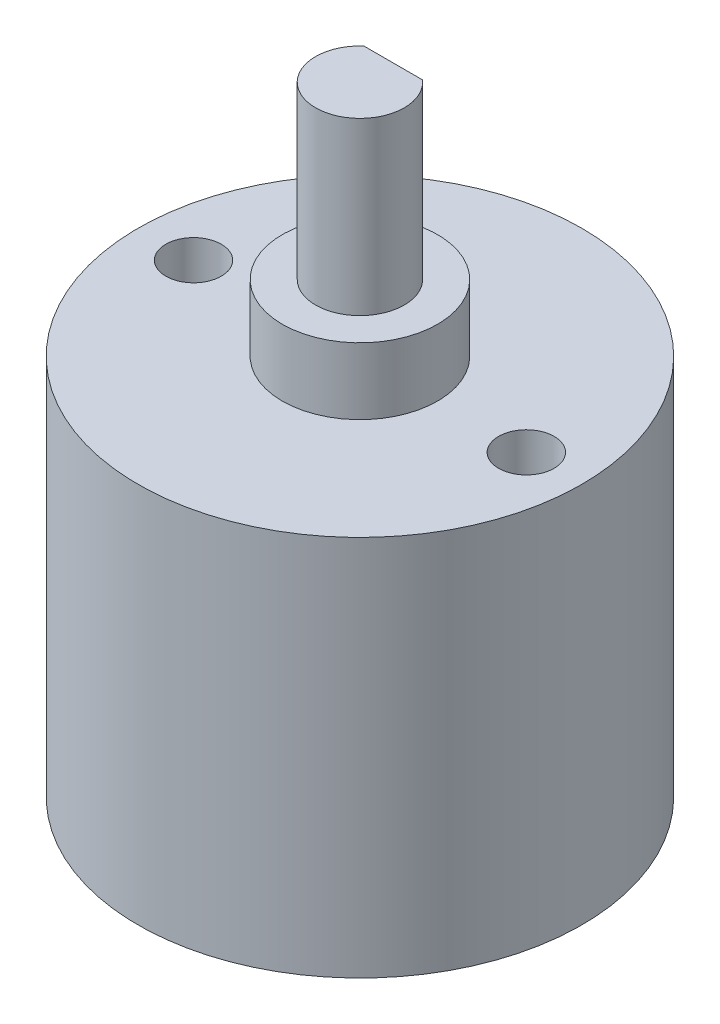
ISO-10303-21;
HEADER;
FILE_DESCRIPTION(('STEP AP214'),'2;1');
FILE_NAME('part.step','',(''),(''),'','','');
FILE_SCHEMA(('AUTOMOTIVE_DESIGN { 1 0 10303 214 1 1 1 1 }'));
ENDSEC;
DATA;
#1=APPLICATION_CONTEXT('core data for automotive mechanical design processes');
#2=APPLICATION_PROTOCOL_DEFINITION('international standard','automotive_design',2000,#1);
#3=PRODUCT_CONTEXT('',#1,'mechanical');
#4=PRODUCT('Part','Part','',(#3));
#5=PRODUCT_RELATED_PRODUCT_CATEGORY('part','',(#4));
#6=PRODUCT_DEFINITION_FORMATION('','',#4);
#7=PRODUCT_DEFINITION_CONTEXT('part definition',#1,'design');
#8=PRODUCT_DEFINITION('design','',#6,#7);
#9=PRODUCT_DEFINITION_SHAPE('','',#8);
#10=(LENGTH_UNIT() NAMED_UNIT(*) SI_UNIT(.MILLI.,.METRE.));
#11=(NAMED_UNIT(*) PLANE_ANGLE_UNIT() SI_UNIT($,.RADIAN.));
#12=(NAMED_UNIT(*) SI_UNIT($,.STERADIAN.) SOLID_ANGLE_UNIT());
#13=UNCERTAINTY_MEASURE_WITH_UNIT(LENGTH_MEASURE(1.E-05),#10,'distance_accuracy_value','');
#14=(GEOMETRIC_REPRESENTATION_CONTEXT(3) GLOBAL_UNCERTAINTY_ASSIGNED_CONTEXT((#13)) GLOBAL_UNIT_ASSIGNED_CONTEXT((#10,
#11,#12)) REPRESENTATION_CONTEXT('',''));
#15=CARTESIAN_POINT('',(0.,0.,0.));
#16=DIRECTION('',(0.,0.,1.));
#17=DIRECTION('',(1.,0.,0.));
#18=AXIS2_PLACEMENT_3D('',#15,#16,#17);
#19=CARTESIAN_POINT('',(0.,20.2,0.));
#20=DIRECTION('',(0.,1.,0.));
#21=DIRECTION('',(0.,0.,1.));
#22=AXIS2_PLACEMENT_3D('',#19,#20,#21);
#23=PLANE('',#22);
#24=CARTESIAN_POINT('',(0.,20.2,0.));
#25=DIRECTION('',(0.,1.,0.));
#26=DIRECTION('',(0.,0.,1.));
#27=AXIS2_PLACEMENT_3D('',#24,#25,#26);
#28=CIRCLE('',#27,3.5);
#29=CARTESIAN_POINT('',(0.,20.2,3.5));
#30=VERTEX_POINT('',#29);
#31=EDGE_CURVE('E81',#30,#30,#28,.T.);
#32=ORIENTED_EDGE('',*,*,#31,.T.);
#33=EDGE_LOOP('',(#32));
#34=FACE_BOUND('',#33,.T.);
#35=DIRECTION('',(1.,0.,0.));
#36=VECTOR('',#35,1.);
#37=CARTESIAN_POINT('',(0.,20.2,-1.5));
#38=LINE('',#37,#36);
#39=CARTESIAN_POINT('',(-1.3228756555323,20.2,-1.5));
#40=VERTEX_POINT('',#39);
#41=CARTESIAN_POINT('',(1.3228756555323,20.2,-1.5));
#42=VERTEX_POINT('',#41);
#43=EDGE_CURVE('E49',#40,#42,#38,.T.);
#44=ORIENTED_EDGE('',*,*,#43,.T.);
#45=CARTESIAN_POINT('',(0.,20.2,0.));
#46=DIRECTION('',(0.,1.,0.));
#47=DIRECTION('',(0.,0.,1.));
#48=AXIS2_PLACEMENT_3D('',#45,#46,#47);
#49=CIRCLE('',#48,2.);
#50=EDGE_CURVE('E63',#40,#42,#49,.T.);
#51=ORIENTED_EDGE('',*,*,#50,.F.);
#52=EDGE_LOOP('',(#44,#51));
#53=FACE_BOUND('',#52,.T.);
#54=ADVANCED_FACE('F35',(#34,#53),#23,.T.);
#55=CARTESIAN_POINT('',(0.,17.2,0.));
#56=DIRECTION('',(0.,-1.,0.));
#57=DIRECTION('',(0.,0.,-1.));
#58=AXIS2_PLACEMENT_3D('',#55,#56,#57);
#59=CYLINDRICAL_SURFACE('',#58,10.);
#60=CARTESIAN_POINT('',(0.,17.2,0.));
#61=DIRECTION('',(0.,1.,0.));
#62=DIRECTION('',(0.,0.,1.));
#63=AXIS2_PLACEMENT_3D('',#60,#61,#62);
#64=CIRCLE('',#63,10.);
#65=CARTESIAN_POINT('',(0.,17.2,-10.));
#66=VERTEX_POINT('',#65);
#67=EDGE_CURVE('E11',#66,#66,#64,.T.);
#68=CARTESIAN_POINT('',(0.,0.,0.));
#69=DIRECTION('',(0.,1.,0.));
#70=DIRECTION('',(0.,0.,1.));
#71=AXIS2_PLACEMENT_3D('',#68,#69,#70);
#72=CIRCLE('',#71,10.);
#73=CARTESIAN_POINT('',(0.,0.,-10.));
#74=VERTEX_POINT('',#73);
#75=EDGE_CURVE('E39',#74,#74,#72,.T.);
#76=CARTESIAN_POINT('',(0.,17.2,-10.));
#77=CARTESIAN_POINT('',(0.,17.0208333333333,-10.));
#78=CARTESIAN_POINT('',(0.,16.8416666666667,-10.));
#79=CARTESIAN_POINT('',(0.,16.4833333333333,-10.));
#80=CARTESIAN_POINT('',(0.,16.3041666666667,-10.));
#81=CARTESIAN_POINT('',(0.,15.9458333333333,-10.));
#82=CARTESIAN_POINT('',(0.,15.7666666666667,-10.));
#83=CARTESIAN_POINT('',(0.,15.4083333333333,-10.));
#84=CARTESIAN_POINT('',(0.,15.2291666666667,-10.));
#85=CARTESIAN_POINT('',(0.,14.8708333333333,-10.));
#86=CARTESIAN_POINT('',(0.,14.6916666666667,-10.));
#87=CARTESIAN_POINT('',(0.,14.3333333333333,-10.));
#88=CARTESIAN_POINT('',(0.,14.1541666666667,-10.));
#89=CARTESIAN_POINT('',(0.,13.7958333333333,-10.));
#90=CARTESIAN_POINT('',(0.,13.6166666666667,-10.));
#91=CARTESIAN_POINT('',(0.,13.2583333333333,-10.));
#92=CARTESIAN_POINT('',(0.,13.0791666666667,-10.));
#93=CARTESIAN_POINT('',(0.,12.7208333333333,-10.));
#94=CARTESIAN_POINT('',(0.,12.5416666666667,-10.));
#95=CARTESIAN_POINT('',(0.,12.1833333333333,-10.));
#96=CARTESIAN_POINT('',(0.,12.0041666666667,-10.));
#97=CARTESIAN_POINT('',(0.,11.6458333333333,-10.));
#98=CARTESIAN_POINT('',(0.,11.4666666666667,-10.));
#99=CARTESIAN_POINT('',(0.,11.1083333333333,-10.));
#100=CARTESIAN_POINT('',(0.,10.9291666666667,-10.));
#101=CARTESIAN_POINT('',(0.,10.5708333333333,-10.));
#102=CARTESIAN_POINT('',(0.,10.3916666666667,-10.));
#103=CARTESIAN_POINT('',(0.,10.0333333333333,-10.));
#104=CARTESIAN_POINT('',(0.,9.85416666666666,-10.));
#105=CARTESIAN_POINT('',(0.,9.49583333333333,-10.));
#106=CARTESIAN_POINT('',(0.,9.31666666666666,-10.));
#107=CARTESIAN_POINT('',(0.,8.95833333333333,-10.));
#108=CARTESIAN_POINT('',(0.,8.77916666666667,-10.));
#109=CARTESIAN_POINT('',(0.,8.42083333333333,-10.));
#110=CARTESIAN_POINT('',(0.,8.24166666666667,-10.));
#111=CARTESIAN_POINT('',(0.,7.88333333333333,-10.));
#112=CARTESIAN_POINT('',(0.,7.70416666666667,-10.));
#113=CARTESIAN_POINT('',(0.,7.34583333333333,-10.));
#114=CARTESIAN_POINT('',(0.,7.16666666666666,-10.));
#115=CARTESIAN_POINT('',(0.,6.80833333333333,-10.));
#116=CARTESIAN_POINT('',(0.,6.62916666666666,-10.));
#117=CARTESIAN_POINT('',(0.,6.27083333333333,-10.));
#118=CARTESIAN_POINT('',(0.,6.09166666666666,-10.));
#119=CARTESIAN_POINT('',(0.,5.73333333333333,-10.));
#120=CARTESIAN_POINT('',(0.,5.55416666666666,-10.));
#121=CARTESIAN_POINT('',(0.,5.19583333333333,-10.));
#122=CARTESIAN_POINT('',(0.,5.01666666666666,-10.));
#123=CARTESIAN_POINT('',(0.,4.65833333333333,-10.));
#124=CARTESIAN_POINT('',(0.,4.47916666666667,-10.));
#125=CARTESIAN_POINT('',(0.,4.12083333333333,-10.));
#126=CARTESIAN_POINT('',(0.,3.94166666666666,-10.));
#127=CARTESIAN_POINT('',(0.,3.58333333333333,-10.));
#128=CARTESIAN_POINT('',(0.,3.40416666666666,-10.));
#129=CARTESIAN_POINT('',(0.,3.04583333333333,-10.));
#130=CARTESIAN_POINT('',(0.,2.86666666666666,-10.));
#131=CARTESIAN_POINT('',(0.,2.50833333333333,-10.));
#132=CARTESIAN_POINT('',(0.,2.32916666666666,-10.));
#133=CARTESIAN_POINT('',(0.,1.97083333333333,-10.));
#134=CARTESIAN_POINT('',(0.,1.79166666666666,-10.));
#135=CARTESIAN_POINT('',(0.,1.43333333333333,-10.));
#136=CARTESIAN_POINT('',(0.,1.25416666666666,-10.));
#137=CARTESIAN_POINT('',(0.,0.895833333333329,-10.));
#138=CARTESIAN_POINT('',(0.,0.716666666666663,-10.));
#139=CARTESIAN_POINT('',(0.,0.35833333333333,-10.));
#140=CARTESIAN_POINT('',(0.,0.179166666666663,-10.));
#141=CARTESIAN_POINT('',(0.,0.,-10.));
#142=B_SPLINE_CURVE_WITH_KNOTS('',3,(#76,#77,#78,#79,#80,#81,#82,#83,#84,#85,#86,#87,#88,#89,
#90,#91,#92,#93,#94,#95,#96,#97,#98,#99,#100,#101,#102,#103,#104,#105,#106,#107,#108,#109,#110,
#111,#112,#113,#114,#115,#116,#117,#118,#119,#120,#121,#122,#123,#124,#125,#126,#127,#128,#129,
#130,#131,#132,#133,#134,#135,#136,#137,#138,#139,#140,#141),.UNSPECIFIED.,.F.,.F.,(4,2,2,2,2,2,
2,2,2,2,2,2,2,2,2,2,2,2,2,2,2,2,2,2,2,2,2,2,2,2,2,2,4),(0.,0.5375,1.075,1.6125,2.15,2.6875,
3.225,3.7625,4.3,4.8375,5.375,5.9125,6.45,6.9875,7.525,8.0625,8.6,9.1375,9.675,10.2125,10.75,
11.2875,11.825,12.3625,12.9,13.4375,13.975,14.5125,15.05,15.5875,16.125,16.6625,17.2),.UNSPECIFIED.);
#143=EDGE_CURVE('BSEAM37',#66,#74,#142,.T.);
#144=ORIENTED_EDGE('',*,*,#67,.F.);
#145=ORIENTED_EDGE('',*,*,#75,.T.);
#146=ORIENTED_EDGE('',*,*,#143,.T.);
#147=ORIENTED_EDGE('',*,*,#143,.F.);
#148=EDGE_LOOP('',(#144,#146,#145,#147));
#149=FACE_BOUND('',#148,.T.);
#150=ADVANCED_FACE('F37',(#149),#59,.T.);
#151=CARTESIAN_POINT('',(0.,17.2,0.));
#152=DIRECTION('',(0.,1.,0.));
#153=DIRECTION('',(0.,0.,1.));
#154=AXIS2_PLACEMENT_3D('',#151,#152,#153);
#155=PLANE('',#154);
#156=CARTESIAN_POINT('',(7.5,17.2,0.));
#157=DIRECTION('',(0.,1.,0.));
#158=DIRECTION('',(0.,0.,1.));
#159=AXIS2_PLACEMENT_3D('',#156,#157,#158);
#160=CIRCLE('',#159,1.25);
#161=CARTESIAN_POINT('',(7.5,17.2,1.25));
#162=VERTEX_POINT('',#161);
#163=EDGE_CURVE('E143',#162,#162,#160,.T.);
#164=ORIENTED_EDGE('',*,*,#163,.F.);
#165=EDGE_LOOP('',(#164));
#166=FACE_BOUND('',#165,.T.);
#167=CARTESIAN_POINT('',(-7.5,17.2,0.));
#168=DIRECTION('',(0.,1.,0.));
#169=DIRECTION('',(0.,0.,1.));
#170=AXIS2_PLACEMENT_3D('',#167,#168,#169);
#171=CIRCLE('',#170,1.25);
#172=CARTESIAN_POINT('',(-7.5,17.2,1.25));
#173=VERTEX_POINT('',#172);
#174=EDGE_CURVE('E142',#173,#173,#171,.T.);
#175=ORIENTED_EDGE('',*,*,#174,.F.);
#176=EDGE_LOOP('',(#175));
#177=FACE_BOUND('',#176,.T.);
#178=CARTESIAN_POINT('',(0.,17.2,0.));
#179=DIRECTION('',(0.,1.,0.));
#180=DIRECTION('',(0.,0.,1.));
#181=AXIS2_PLACEMENT_3D('',#178,#179,#180);
#182=CIRCLE('',#181,3.5);
#183=CARTESIAN_POINT('',(0.,17.2,3.5));
#184=VERTEX_POINT('',#183);
#185=EDGE_CURVE('E80',#184,#184,#182,.T.);
#186=ORIENTED_EDGE('',*,*,#185,.F.);
#187=EDGE_LOOP('',(#186));
#188=FACE_BOUND('',#187,.T.);
#189=ORIENTED_EDGE('',*,*,#67,.T.);
#190=EDGE_LOOP('',(#189));
#191=FACE_BOUND('',#190,.T.);
#192=ADVANCED_FACE('F89',(#166,#177,#188,#191),#155,.T.);
#193=CARTESIAN_POINT('',(0.,0.,0.));
#194=DIRECTION('',(0.,1.,0.));
#195=DIRECTION('',(0.,0.,1.));
#196=AXIS2_PLACEMENT_3D('',#193,#194,#195);
#197=PLANE('',#196);
#198=ORIENTED_EDGE('',*,*,#75,.F.);
#199=EDGE_LOOP('',(#198));
#200=FACE_BOUND('',#199,.T.);
#201=ADVANCED_FACE('F92',(#200),#197,.F.);
#202=CARTESIAN_POINT('',(0.,20.2,0.));
#203=DIRECTION('',(0.,-1.,0.));
#204=DIRECTION('',(0.,0.,-1.));
#205=AXIS2_PLACEMENT_3D('',#202,#203,#204);
#206=CYLINDRICAL_SURFACE('',#205,3.5);
#207=ORIENTED_EDGE('',*,*,#31,.F.);
#208=EDGE_LOOP('',(#207));
#209=FACE_BOUND('',#208,.T.);
#210=ORIENTED_EDGE('',*,*,#185,.T.);
#211=EDGE_LOOP('',(#210));
#212=FACE_BOUND('',#211,.T.);
#213=ADVANCED_FACE('F87',(#209,#212),#206,.T.);
#214=CARTESIAN_POINT('',(0.,27.9,0.));
#215=DIRECTION('',(0.,-1.,0.));
#216=DIRECTION('',(0.,0.,-1.));
#217=AXIS2_PLACEMENT_3D('',#214,#215,#216);
#218=CYLINDRICAL_SURFACE('',#217,2.);
#219=ORIENTED_EDGE('',*,*,#50,.T.);
#220=DIRECTION('',(0.,-1.,0.));
#221=VECTOR('',#220,1.);
#222=CARTESIAN_POINT('',(1.3228756555323,27.9,-1.5));
#223=LINE('',#222,#221);
#224=CARTESIAN_POINT('',(1.3228756555323,27.9,-1.5));
#225=VERTEX_POINT('',#224);
#226=EDGE_CURVE('E71',#225,#42,#223,.T.);
#227=ORIENTED_EDGE('',*,*,#226,.F.);
#228=CARTESIAN_POINT('',(0.,27.9,0.));
#229=DIRECTION('',(0.,1.,0.));
#230=DIRECTION('',(0.,0.,1.));
#231=AXIS2_PLACEMENT_3D('',#228,#229,#230);
#232=CIRCLE('',#231,2.);
#233=CARTESIAN_POINT('',(-1.3228756555323,27.9,-1.5));
#234=VERTEX_POINT('',#233);
#235=EDGE_CURVE('E69',#234,#225,#232,.T.);
#236=ORIENTED_EDGE('',*,*,#235,.F.);
#237=DIRECTION('',(0.,-1.,0.));
#238=VECTOR('',#237,1.);
#239=CARTESIAN_POINT('',(-1.3228756555323,27.9,-1.5));
#240=LINE('',#239,#238);
#241=EDGE_CURVE('E57',#234,#40,#240,.T.);
#242=ORIENTED_EDGE('',*,*,#241,.T.);
#243=EDGE_LOOP('',(#219,#227,#236,#242));
#244=FACE_BOUND('',#243,.T.);
#245=ADVANCED_FACE('F68',(#244),#218,.T.);
#246=CARTESIAN_POINT('',(0.,27.9,-1.5));
#247=DIRECTION('',(0.,0.,-1.));
#248=DIRECTION('',(-1.,0.,0.));
#249=AXIS2_PLACEMENT_3D('',#246,#247,#248);
#250=PLANE('',#249);
#251=ORIENTED_EDGE('',*,*,#43,.F.);
#252=ORIENTED_EDGE('',*,*,#241,.F.);
#253=DIRECTION('',(1.,0.,0.));
#254=VECTOR('',#253,1.);
#255=CARTESIAN_POINT('',(0.,27.9,-1.5));
#256=LINE('',#255,#254);
#257=EDGE_CURVE('E72',#234,#225,#256,.T.);
#258=ORIENTED_EDGE('',*,*,#257,.T.);
#259=ORIENTED_EDGE('',*,*,#226,.T.);
#260=EDGE_LOOP('',(#251,#252,#258,#259));
#261=FACE_BOUND('',#260,.T.);
#262=ADVANCED_FACE('F74',(#261),#250,.T.);
#263=CARTESIAN_POINT('',(0.,27.9,0.));
#264=DIRECTION('',(0.,1.,0.));
#265=DIRECTION('',(0.,0.,1.));
#266=AXIS2_PLACEMENT_3D('',#263,#264,#265);
#267=PLANE('',#266);
#268=ORIENTED_EDGE('',*,*,#235,.T.);
#269=ORIENTED_EDGE('',*,*,#257,.F.);
#270=EDGE_LOOP('',(#268,#269));
#271=FACE_BOUND('',#270,.T.);
#272=ADVANCED_FACE('F118',(#271),#267,.T.);
#273=CARTESIAN_POINT('',(-7.5,14.025,0.));
#274=DIRECTION('',(0.,1.,0.));
#275=DIRECTION('',(0.,0.,1.));
#276=AXIS2_PLACEMENT_3D('',#273,#274,#275);
#277=CYLINDRICAL_SURFACE('',#276,1.25);
#278=CARTESIAN_POINT('',(-7.5,14.025,0.));
#279=DIRECTION('',(0.,1.,0.));
#280=DIRECTION('',(0.,0.,1.));
#281=AXIS2_PLACEMENT_3D('',#278,#279,#280);
#282=CIRCLE('',#281,1.25);
#283=CARTESIAN_POINT('',(-7.5,14.025,1.25));
#284=VERTEX_POINT('',#283);
#285=EDGE_CURVE('E66',#284,#284,#282,.T.);
#286=ORIENTED_EDGE('',*,*,#285,.F.);
#287=EDGE_LOOP('',(#286));
#288=FACE_BOUND('',#287,.T.);
#289=ORIENTED_EDGE('',*,*,#174,.T.);
#290=EDGE_LOOP('',(#289));
#291=FACE_BOUND('',#290,.T.);
#292=ADVANCED_FACE('F121',(#288,#291),#277,.F.);
#293=CARTESIAN_POINT('',(-7.5,14.025,0.));
#294=DIRECTION('',(0.,1.,0.));
#295=DIRECTION('',(0.,0.,1.));
#296=AXIS2_PLACEMENT_3D('',#293,#294,#295);
#297=PLANE('',#296);
#298=ORIENTED_EDGE('',*,*,#285,.T.);
#299=EDGE_LOOP('',(#298));
#300=FACE_BOUND('',#299,.T.);
#301=ADVANCED_FACE('F125',(#300),#297,.T.);
#302=CARTESIAN_POINT('',(7.5,14.025,0.));
#303=DIRECTION('',(0.,1.,0.));
#304=DIRECTION('',(0.,0.,1.));
#305=AXIS2_PLACEMENT_3D('',#302,#303,#304);
#306=CYLINDRICAL_SURFACE('',#305,1.25);
#307=CARTESIAN_POINT('',(7.5,14.025,0.));
#308=DIRECTION('',(0.,1.,0.));
#309=DIRECTION('',(0.,0.,1.));
#310=AXIS2_PLACEMENT_3D('',#307,#308,#309);
#311=CIRCLE('',#310,1.25);
#312=CARTESIAN_POINT('',(7.5,14.025,1.25));
#313=VERTEX_POINT('',#312);
#314=EDGE_CURVE('E141',#313,#313,#311,.T.);
#315=ORIENTED_EDGE('',*,*,#314,.F.);
#316=EDGE_LOOP('',(#315));
#317=FACE_BOUND('',#316,.T.);
#318=ORIENTED_EDGE('',*,*,#163,.T.);
#319=EDGE_LOOP('',(#318));
#320=FACE_BOUND('',#319,.T.);
#321=ADVANCED_FACE('F129',(#317,#320),#306,.F.);
#322=CARTESIAN_POINT('',(7.5,14.025,0.));
#323=DIRECTION('',(0.,1.,0.));
#324=DIRECTION('',(0.,0.,1.));
#325=AXIS2_PLACEMENT_3D('',#322,#323,#324);
#326=PLANE('',#325);
#327=ORIENTED_EDGE('',*,*,#314,.T.);
#328=EDGE_LOOP('',(#327));
#329=FACE_BOUND('',#328,.T.);
#330=ADVANCED_FACE('F133',(#329),#326,.T.);
#331=CLOSED_SHELL('',(#54,#150,#192,#201,#213,#245,#262,#272,#292,#301,#321,#330));
#332=MANIFOLD_SOLID_BREP('B2',#331);
#333=ADVANCED_BREP_SHAPE_REPRESENTATION('',(#18,#332),#14);
#334=SHAPE_DEFINITION_REPRESENTATION(#9,#333);
ENDSEC;
END-ISO-10303-21;
